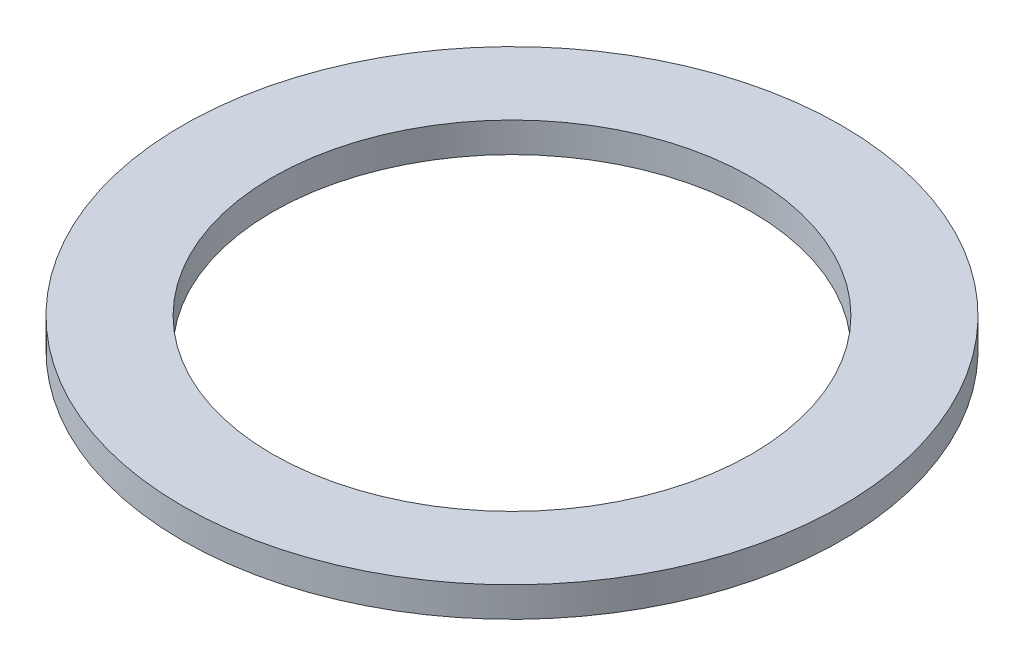
ISO-10303-21;
HEADER;
FILE_DESCRIPTION(('STEP AP214'),'2;1');
FILE_NAME('part.step','',(''),(''),'','','');
FILE_SCHEMA(('AUTOMOTIVE_DESIGN { 1 0 10303 214 1 1 1 1 }'));
ENDSEC;
DATA;
#1=APPLICATION_CONTEXT('core data for automotive mechanical design processes');
#2=APPLICATION_PROTOCOL_DEFINITION('international standard','automotive_design',2000,#1);
#3=PRODUCT_CONTEXT('',#1,'mechanical');
#4=PRODUCT('Part','Part','',(#3));
#5=PRODUCT_RELATED_PRODUCT_CATEGORY('part','',(#4));
#6=PRODUCT_DEFINITION_FORMATION('','',#4);
#7=PRODUCT_DEFINITION_CONTEXT('part definition',#1,'design');
#8=PRODUCT_DEFINITION('design','',#6,#7);
#9=PRODUCT_DEFINITION_SHAPE('','',#8);
#10=(LENGTH_UNIT() NAMED_UNIT(*) SI_UNIT(.MILLI.,.METRE.));
#11=(NAMED_UNIT(*) PLANE_ANGLE_UNIT() SI_UNIT($,.RADIAN.));
#12=(NAMED_UNIT(*) SI_UNIT($,.STERADIAN.) SOLID_ANGLE_UNIT());
#13=UNCERTAINTY_MEASURE_WITH_UNIT(LENGTH_MEASURE(1.E-05),#10,'distance_accuracy_value','');
#14=(GEOMETRIC_REPRESENTATION_CONTEXT(3) GLOBAL_UNCERTAINTY_ASSIGNED_CONTEXT((#13)) GLOBAL_UNIT_ASSIGNED_CONTEXT((#10,
#11,#12)) REPRESENTATION_CONTEXT('',''));
#15=CARTESIAN_POINT('',(0.,0.,0.));
#16=DIRECTION('',(0.,0.,1.));
#17=DIRECTION('',(1.,0.,0.));
#18=AXIS2_PLACEMENT_3D('',#15,#16,#17);
#19=CARTESIAN_POINT('',(0.,1.,0.));
#20=DIRECTION('',(0.,-1.,0.));
#21=DIRECTION('',(0.,0.,-1.));
#22=AXIS2_PLACEMENT_3D('',#19,#20,#21);
#23=CYLINDRICAL_SURFACE('',#22,11.);
#24=CARTESIAN_POINT('',(0.,1.,0.));
#25=DIRECTION('',(0.,1.,0.));
#26=DIRECTION('',(0.,0.,1.));
#27=AXIS2_PLACEMENT_3D('',#24,#25,#26);
#28=CIRCLE('',#27,11.);
#29=CARTESIAN_POINT('',(0.,1.,11.));
#30=VERTEX_POINT('',#29);
#31=EDGE_CURVE('E10',#30,#30,#28,.T.);
#32=ORIENTED_EDGE('',*,*,#31,.F.);
#33=EDGE_LOOP('',(#32));
#34=FACE_BOUND('',#33,.T.);
#35=CARTESIAN_POINT('',(0.,0.,0.));
#36=DIRECTION('',(0.,1.,0.));
#37=DIRECTION('',(0.,0.,1.));
#38=AXIS2_PLACEMENT_3D('',#35,#36,#37);
#39=CIRCLE('',#38,11.);
#40=CARTESIAN_POINT('',(0.,0.,11.));
#41=VERTEX_POINT('',#40);
#42=EDGE_CURVE('E35',#41,#41,#39,.T.);
#43=ORIENTED_EDGE('',*,*,#42,.T.);
#44=EDGE_LOOP('',(#43));
#45=FACE_BOUND('',#44,.T.);
#46=ADVANCED_FACE('F32',(#34,#45),#23,.T.);
#47=CARTESIAN_POINT('',(0.,1.,0.));
#48=DIRECTION('',(0.,1.,0.));
#49=DIRECTION('',(0.,0.,1.));
#50=AXIS2_PLACEMENT_3D('',#47,#48,#49);
#51=PLANE('',#50);
#52=CARTESIAN_POINT('',(0.,1.,0.));
#53=DIRECTION('',(0.,1.,0.));
#54=DIRECTION('',(0.,0.,1.));
#55=AXIS2_PLACEMENT_3D('',#52,#53,#54);
#56=CIRCLE('',#55,8.);
#57=CARTESIAN_POINT('',(0.,1.,8.));
#58=VERTEX_POINT('',#57);
#59=EDGE_CURVE('E44',#58,#58,#56,.T.);
#60=ORIENTED_EDGE('',*,*,#59,.F.);
#61=EDGE_LOOP('',(#60));
#62=FACE_BOUND('',#61,.T.);
#63=ORIENTED_EDGE('',*,*,#31,.T.);
#64=EDGE_LOOP('',(#63));
#65=FACE_BOUND('',#64,.T.);
#66=ADVANCED_FACE('F59',(#62,#65),#51,.T.);
#67=CARTESIAN_POINT('',(0.,0.,0.));
#68=DIRECTION('',(0.,1.,0.));
#69=DIRECTION('',(0.,0.,1.));
#70=AXIS2_PLACEMENT_3D('',#67,#68,#69);
#71=PLANE('',#70);
#72=CARTESIAN_POINT('',(0.,0.,0.));
#73=DIRECTION('',(0.,1.,0.));
#74=DIRECTION('',(0.,0.,1.));
#75=AXIS2_PLACEMENT_3D('',#72,#73,#74);
#76=CIRCLE('',#75,8.);
#77=CARTESIAN_POINT('',(0.,0.,8.));
#78=VERTEX_POINT('',#77);
#79=EDGE_CURVE('E42',#78,#78,#76,.T.);
#80=ORIENTED_EDGE('',*,*,#79,.T.);
#81=EDGE_LOOP('',(#80));
#82=FACE_BOUND('',#81,.T.);
#83=ORIENTED_EDGE('',*,*,#42,.F.);
#84=EDGE_LOOP('',(#83));
#85=FACE_BOUND('',#84,.T.);
#86=ADVANCED_FACE('F50',(#82,#85),#71,.F.);
#87=CARTESIAN_POINT('',(0.,0.,0.));
#88=DIRECTION('',(0.,1.,0.));
#89=DIRECTION('',(0.,0.,1.));
#90=AXIS2_PLACEMENT_3D('',#87,#88,#89);
#91=CYLINDRICAL_SURFACE('',#90,8.);
#92=ORIENTED_EDGE('',*,*,#79,.F.);
#93=EDGE_LOOP('',(#92));
#94=FACE_BOUND('',#93,.T.);
#95=ORIENTED_EDGE('',*,*,#59,.T.);
#96=EDGE_LOOP('',(#95));
#97=FACE_BOUND('',#96,.T.);
#98=ADVANCED_FACE('F53',(#94,#97),#91,.F.);
#99=CLOSED_SHELL('',(#46,#66,#86,#98));
#100=MANIFOLD_SOLID_BREP('B2',#99);
#101=ADVANCED_BREP_SHAPE_REPRESENTATION('',(#18,#100),#14);
#102=SHAPE_DEFINITION_REPRESENTATION(#9,#101);
ENDSEC;
END-ISO-10303-21;
